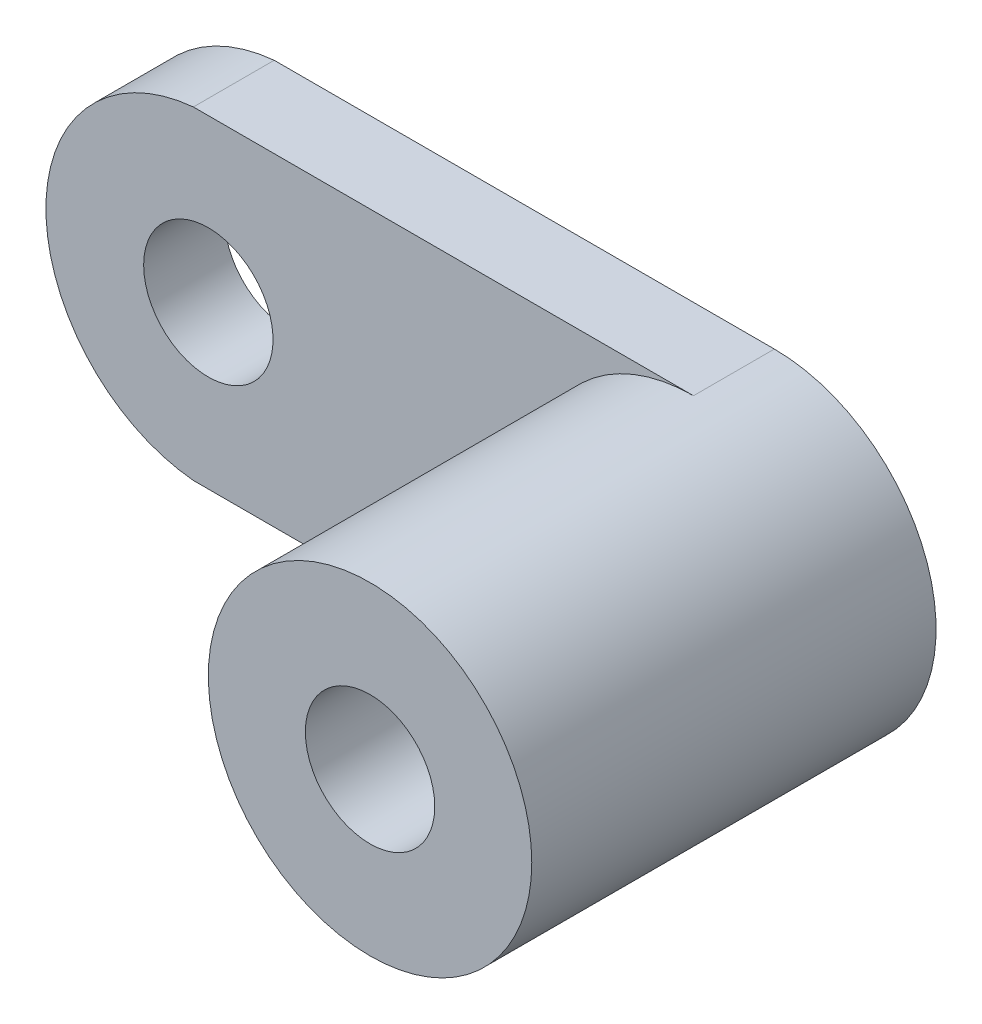
ISO-10303-21;
HEADER;
FILE_DESCRIPTION(('STEP AP214'),'2;1');
FILE_NAME('part.step','',(''),(''),'','','');
FILE_SCHEMA(('AUTOMOTIVE_DESIGN { 1 0 10303 214 1 1 1 1 }'));
ENDSEC;
DATA;
#1=APPLICATION_CONTEXT('core data for automotive mechanical design processes');
#2=APPLICATION_PROTOCOL_DEFINITION('international standard','automotive_design',2000,#1);
#3=PRODUCT_CONTEXT('',#1,'mechanical');
#4=PRODUCT('Part','Part','',(#3));
#5=PRODUCT_RELATED_PRODUCT_CATEGORY('part','',(#4));
#6=PRODUCT_DEFINITION_FORMATION('','',#4);
#7=PRODUCT_DEFINITION_CONTEXT('part definition',#1,'design');
#8=PRODUCT_DEFINITION('design','',#6,#7);
#9=PRODUCT_DEFINITION_SHAPE('','',#8);
#10=(LENGTH_UNIT() NAMED_UNIT(*) SI_UNIT(.MILLI.,.METRE.));
#11=(NAMED_UNIT(*) PLANE_ANGLE_UNIT() SI_UNIT($,.RADIAN.));
#12=(NAMED_UNIT(*) SI_UNIT($,.STERADIAN.) SOLID_ANGLE_UNIT());
#13=UNCERTAINTY_MEASURE_WITH_UNIT(LENGTH_MEASURE(1.E-05),#10,'distance_accuracy_value','');
#14=(GEOMETRIC_REPRESENTATION_CONTEXT(3) GLOBAL_UNCERTAINTY_ASSIGNED_CONTEXT((#13)) GLOBAL_UNIT_ASSIGNED_CONTEXT((#10,
#11,#12)) REPRESENTATION_CONTEXT('',''));
#15=CARTESIAN_POINT('',(0.,0.,0.));
#16=DIRECTION('',(0.,0.,1.));
#17=DIRECTION('',(1.,0.,0.));
#18=AXIS2_PLACEMENT_3D('',#15,#16,#17);
#19=CARTESIAN_POINT('',(0.,0.,8.));
#20=DIRECTION('',(0.,0.,1.));
#21=DIRECTION('',(1.,0.,0.));
#22=AXIS2_PLACEMENT_3D('',#19,#20,#21);
#23=PLANE('',#22);
#24=CARTESIAN_POINT('',(0.,0.,8.));
#25=DIRECTION('',(0.,0.,1.));
#26=DIRECTION('',(1.,0.,0.));
#27=AXIS2_PLACEMENT_3D('',#24,#25,#26);
#28=CIRCLE('',#27,4.);
#29=CARTESIAN_POINT('',(4.,0.,8.));
#30=VERTEX_POINT('',#29);
#31=EDGE_CURVE('E11',#30,#30,#28,.T.);
#32=ORIENTED_EDGE('',*,*,#31,.T.);
#33=EDGE_LOOP('',(#32));
#34=FACE_BOUND('',#33,.T.);
#35=CARTESIAN_POINT('',(0.,0.,8.));
#36=DIRECTION('',(0.,0.,1.));
#37=DIRECTION('',(1.,0.,0.));
#38=AXIS2_PLACEMENT_3D('',#35,#36,#37);
#39=CIRCLE('',#38,1.6);
#40=CARTESIAN_POINT('',(1.6,0.,8.));
#41=VERTEX_POINT('',#40);
#42=EDGE_CURVE('E108',#41,#41,#39,.T.);
#43=ORIENTED_EDGE('',*,*,#42,.F.);
#44=EDGE_LOOP('',(#43));
#45=FACE_BOUND('',#44,.T.);
#46=ADVANCED_FACE('F32',(#34,#45),#23,.T.);
#47=CARTESIAN_POINT('',(0.,0.,8.));
#48=DIRECTION('',(0.,0.,-1.));
#49=DIRECTION('',(-1.,0.,0.));
#50=AXIS2_PLACEMENT_3D('',#47,#48,#49);
#51=CYLINDRICAL_SURFACE('',#50,4.);
#52=ORIENTED_EDGE('',*,*,#31,.F.);
#53=EDGE_LOOP('',(#52));
#54=FACE_BOUND('',#53,.T.);
#55=CARTESIAN_POINT('',(0.,0.,0.));
#56=DIRECTION('',(0.,0.,1.));
#57=DIRECTION('',(1.,0.,0.));
#58=AXIS2_PLACEMENT_3D('',#55,#56,#57);
#59=CIRCLE('',#58,4.);
#60=CARTESIAN_POINT('',(0.,4.,0.));
#61=VERTEX_POINT('',#60);
#62=CARTESIAN_POINT('',(0.,-4.,0.));
#63=VERTEX_POINT('',#62);
#64=EDGE_CURVE('E36',#61,#63,#59,.T.);
#65=ORIENTED_EDGE('',*,*,#64,.T.);
#66=DIRECTION('',(0.,0.,1.));
#67=VECTOR('',#66,1.);
#68=CARTESIAN_POINT('',(0.,-4.,-2.));
#69=LINE('',#68,#67);
#70=CARTESIAN_POINT('',(0.,-4.,-2.));
#71=VERTEX_POINT('',#70);
#72=EDGE_CURVE('E92',#71,#63,#69,.T.);
#73=ORIENTED_EDGE('',*,*,#72,.F.);
#74=CARTESIAN_POINT('',(0.,0.,-2.));
#75=DIRECTION('',(0.,0.,-1.));
#76=DIRECTION('',(-1.,0.,0.));
#77=AXIS2_PLACEMENT_3D('',#74,#75,#76);
#78=CIRCLE('',#77,4.);
#79=CARTESIAN_POINT('',(0.,4.,-2.));
#80=VERTEX_POINT('',#79);
#81=EDGE_CURVE('E82',#80,#71,#78,.T.);
#82=ORIENTED_EDGE('',*,*,#81,.F.);
#83=DIRECTION('',(0.,0.,1.));
#84=VECTOR('',#83,1.);
#85=CARTESIAN_POINT('',(0.,4.,-2.));
#86=LINE('',#85,#84);
#87=EDGE_CURVE('E47',#80,#61,#86,.T.);
#88=ORIENTED_EDGE('',*,*,#87,.T.);
#89=EDGE_LOOP('',(#65,#73,#82,#88));
#90=FACE_BOUND('',#89,.T.);
#91=ADVANCED_FACE('F34',(#54,#90),#51,.T.);
#92=CARTESIAN_POINT('',(0.,0.,8.));
#93=DIRECTION('',(0.,0.,-1.));
#94=DIRECTION('',(-1.,0.,0.));
#95=AXIS2_PLACEMENT_3D('',#92,#93,#94);
#96=CYLINDRICAL_SURFACE('',#95,1.6);
#97=ORIENTED_EDGE('',*,*,#42,.T.);
#98=EDGE_LOOP('',(#97));
#99=FACE_BOUND('',#98,.T.);
#100=CARTESIAN_POINT('',(0.,0.,-2.));
#101=DIRECTION('',(0.,0.,-1.));
#102=DIRECTION('',(-1.,0.,0.));
#103=AXIS2_PLACEMENT_3D('',#100,#101,#102);
#104=CIRCLE('',#103,1.6);
#105=CARTESIAN_POINT('',(-1.6,0.,-2.));
#106=VERTEX_POINT('',#105);
#107=EDGE_CURVE('E157',#106,#106,#104,.T.);
#108=ORIENTED_EDGE('',*,*,#107,.T.);
#109=EDGE_LOOP('',(#108));
#110=FACE_BOUND('',#109,.T.);
#111=ADVANCED_FACE('F135',(#99,#110),#96,.F.);
#112=CARTESIAN_POINT('',(-12.,0.,-2.));
#113=DIRECTION('',(0.,0.,-1.));
#114=DIRECTION('',(-1.,0.,0.));
#115=AXIS2_PLACEMENT_3D('',#112,#113,#114);
#116=PLANE('',#115);
#117=CARTESIAN_POINT('',(-12.,0.,-2.));
#118=DIRECTION('',(0.,0.,-1.));
#119=DIRECTION('',(-1.,0.,0.));
#120=AXIS2_PLACEMENT_3D('',#117,#118,#119);
#121=CIRCLE('',#120,1.6);
#122=CARTESIAN_POINT('',(-13.6,0.,-2.));
#123=VERTEX_POINT('',#122);
#124=EDGE_CURVE('E102',#123,#123,#121,.T.);
#125=ORIENTED_EDGE('',*,*,#124,.F.);
#126=EDGE_LOOP('',(#125));
#127=FACE_BOUND('',#126,.T.);
#128=CARTESIAN_POINT('',(-12.,0.,-2.));
#129=DIRECTION('',(0.,0.,-1.));
#130=DIRECTION('',(-1.,0.,0.));
#131=AXIS2_PLACEMENT_3D('',#128,#129,#130);
#132=CIRCLE('',#131,4.0171098357565);
#133=CARTESIAN_POINT('',(-12.3703666190838,-4.,-2.));
#134=VERTEX_POINT('',#133);
#135=CARTESIAN_POINT('',(-12.3703666190838,4.,-2.));
#136=VERTEX_POINT('',#135);
#137=EDGE_CURVE('E85',#134,#136,#132,.T.);
#138=ORIENTED_EDGE('',*,*,#137,.T.);
#139=DIRECTION('',(1.,0.,0.));
#140=VECTOR('',#139,1.);
#141=CARTESIAN_POINT('',(0.,4.,-2.));
#142=LINE('',#141,#140);
#143=EDGE_CURVE('E79',#136,#80,#142,.T.);
#144=ORIENTED_EDGE('',*,*,#143,.T.);
#145=ORIENTED_EDGE('',*,*,#81,.T.);
#146=DIRECTION('',(-1.,0.,0.));
#147=VECTOR('',#146,1.);
#148=CARTESIAN_POINT('',(0.,-4.,-2.));
#149=LINE('',#148,#147);
#150=EDGE_CURVE('E56',#71,#134,#149,.T.);
#151=ORIENTED_EDGE('',*,*,#150,.T.);
#152=EDGE_LOOP('',(#138,#144,#145,#151));
#153=FACE_BOUND('',#152,.T.);
#154=ORIENTED_EDGE('',*,*,#107,.F.);
#155=EDGE_LOOP('',(#154));
#156=FACE_BOUND('',#155,.T.);
#157=ADVANCED_FACE('F80',(#127,#153,#156),#116,.T.);
#158=CARTESIAN_POINT('',(-12.,0.,0.));
#159=DIRECTION('',(0.,0.,-1.));
#160=DIRECTION('',(-1.,0.,0.));
#161=AXIS2_PLACEMENT_3D('',#158,#159,#160);
#162=PLANE('',#161);
#163=ORIENTED_EDGE('',*,*,#64,.F.);
#164=DIRECTION('',(1.,0.,0.));
#165=VECTOR('',#164,1.);
#166=CARTESIAN_POINT('',(0.,4.,0.));
#167=LINE('',#166,#165);
#168=CARTESIAN_POINT('',(-12.3703666190838,4.,0.));
#169=VERTEX_POINT('',#168);
#170=EDGE_CURVE('E89',#169,#61,#167,.T.);
#171=ORIENTED_EDGE('',*,*,#170,.F.);
#172=CARTESIAN_POINT('',(-12.,0.,0.));
#173=DIRECTION('',(0.,0.,-1.));
#174=DIRECTION('',(-1.,0.,0.));
#175=AXIS2_PLACEMENT_3D('',#172,#173,#174);
#176=CIRCLE('',#175,4.0171098357565);
#177=CARTESIAN_POINT('',(-12.3703666190838,-4.,0.));
#178=VERTEX_POINT('',#177);
#179=EDGE_CURVE('E99',#178,#169,#176,.T.);
#180=ORIENTED_EDGE('',*,*,#179,.F.);
#181=DIRECTION('',(-1.,0.,0.));
#182=VECTOR('',#181,1.);
#183=CARTESIAN_POINT('',(0.,-4.,0.));
#184=LINE('',#183,#182);
#185=EDGE_CURVE('E72',#63,#178,#184,.T.);
#186=ORIENTED_EDGE('',*,*,#185,.F.);
#187=EDGE_LOOP('',(#163,#171,#180,#186));
#188=FACE_BOUND('',#187,.T.);
#189=CARTESIAN_POINT('',(-12.,0.,0.));
#190=DIRECTION('',(0.,0.,-1.));
#191=DIRECTION('',(-1.,0.,0.));
#192=AXIS2_PLACEMENT_3D('',#189,#190,#191);
#193=CIRCLE('',#192,1.6);
#194=CARTESIAN_POINT('',(-13.6,0.,0.));
#195=VERTEX_POINT('',#194);
#196=EDGE_CURVE('E154',#195,#195,#193,.T.);
#197=ORIENTED_EDGE('',*,*,#196,.T.);
#198=EDGE_LOOP('',(#197));
#199=FACE_BOUND('',#198,.T.);
#200=ADVANCED_FACE('F113',(#188,#199),#162,.F.);
#201=CARTESIAN_POINT('',(-12.,0.,-2.));
#202=DIRECTION('',(0.,0.,1.));
#203=DIRECTION('',(1.,0.,0.));
#204=AXIS2_PLACEMENT_3D('',#201,#202,#203);
#205=CYLINDRICAL_SURFACE('',#204,4.0171098357565);
#206=ORIENTED_EDGE('',*,*,#179,.T.);
#207=DIRECTION('',(0.,0.,1.));
#208=VECTOR('',#207,1.);
#209=CARTESIAN_POINT('',(-12.3703666190838,4.,-2.));
#210=LINE('',#209,#208);
#211=EDGE_CURVE('E91',#136,#169,#210,.T.);
#212=ORIENTED_EDGE('',*,*,#211,.F.);
#213=ORIENTED_EDGE('',*,*,#137,.F.);
#214=DIRECTION('',(0.,0.,1.));
#215=VECTOR('',#214,1.);
#216=CARTESIAN_POINT('',(-12.3703666190838,-4.,-2.));
#217=LINE('',#216,#215);
#218=EDGE_CURVE('E95',#134,#178,#217,.T.);
#219=ORIENTED_EDGE('',*,*,#218,.T.);
#220=EDGE_LOOP('',(#206,#212,#213,#219));
#221=FACE_BOUND('',#220,.T.);
#222=ADVANCED_FACE('F117',(#221),#205,.T.);
#223=CARTESIAN_POINT('',(0.,4.,-2.));
#224=DIRECTION('',(0.,-1.,0.));
#225=DIRECTION('',(0.,0.,-1.));
#226=AXIS2_PLACEMENT_3D('',#223,#224,#225);
#227=PLANE('',#226);
#228=ORIENTED_EDGE('',*,*,#170,.T.);
#229=ORIENTED_EDGE('',*,*,#87,.F.);
#230=ORIENTED_EDGE('',*,*,#143,.F.);
#231=ORIENTED_EDGE('',*,*,#211,.T.);
#232=EDGE_LOOP('',(#228,#229,#230,#231));
#233=FACE_BOUND('',#232,.T.);
#234=ADVANCED_FACE('F88',(#233),#227,.F.);
#235=CARTESIAN_POINT('',(0.,-4.,-2.));
#236=DIRECTION('',(0.,1.,0.));
#237=DIRECTION('',(0.,0.,1.));
#238=AXIS2_PLACEMENT_3D('',#235,#236,#237);
#239=PLANE('',#238);
#240=ORIENTED_EDGE('',*,*,#185,.T.);
#241=ORIENTED_EDGE('',*,*,#218,.F.);
#242=ORIENTED_EDGE('',*,*,#150,.F.);
#243=ORIENTED_EDGE('',*,*,#72,.T.);
#244=EDGE_LOOP('',(#240,#241,#242,#243));
#245=FACE_BOUND('',#244,.T.);
#246=ADVANCED_FACE('F118',(#245),#239,.F.);
#247=CARTESIAN_POINT('',(-12.,0.,-2.));
#248=DIRECTION('',(0.,0.,1.));
#249=DIRECTION('',(1.,0.,0.));
#250=AXIS2_PLACEMENT_3D('',#247,#248,#249);
#251=CYLINDRICAL_SURFACE('',#250,1.6);
#252=ORIENTED_EDGE('',*,*,#124,.T.);
#253=EDGE_LOOP('',(#252));
#254=FACE_BOUND('',#253,.T.);
#255=ORIENTED_EDGE('',*,*,#196,.F.);
#256=EDGE_LOOP('',(#255));
#257=FACE_BOUND('',#256,.T.);
#258=ADVANCED_FACE('F120',(#254,#257),#251,.F.);
#259=CLOSED_SHELL('',(#46,#91,#111,#157,#200,#222,#234,#246,#258));
#260=MANIFOLD_SOLID_BREP('B2',#259);
#261=ADVANCED_BREP_SHAPE_REPRESENTATION('',(#18,#260),#14);
#262=SHAPE_DEFINITION_REPRESENTATION(#9,#261);
ENDSEC;
END-ISO-10303-21;
